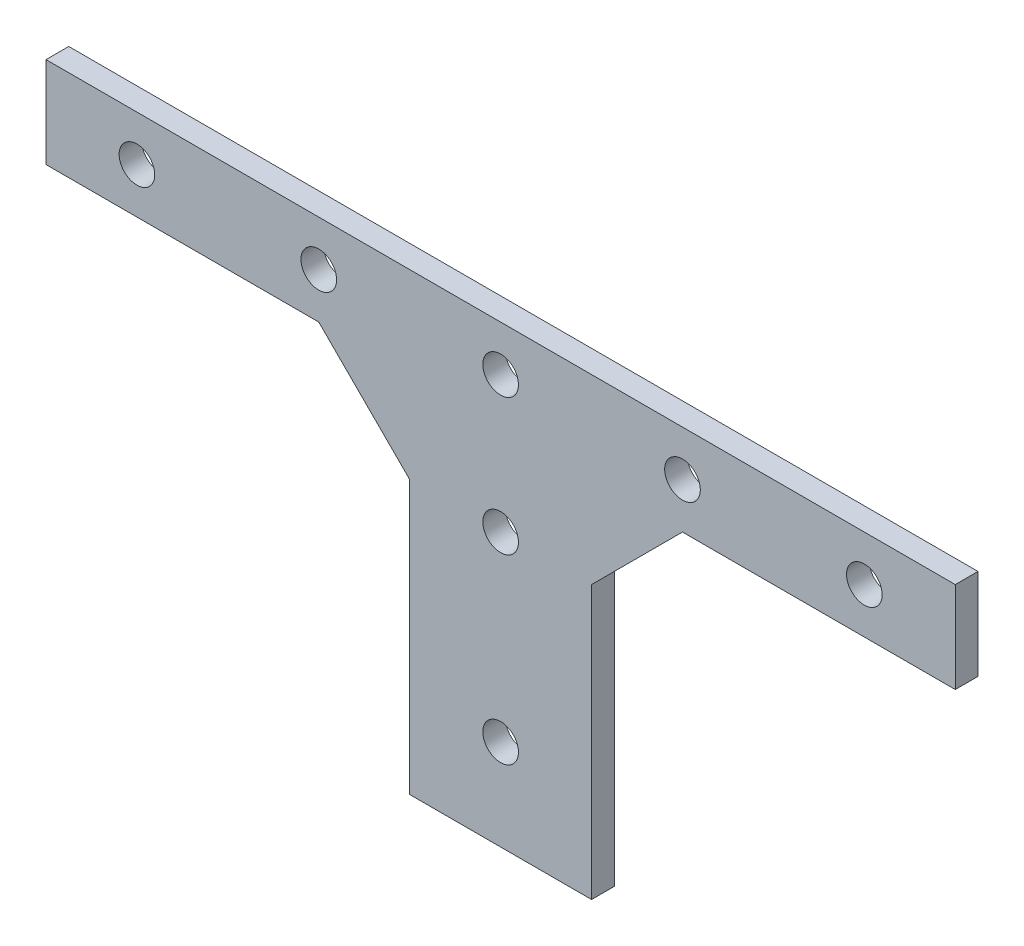
ISO-10303-21;
HEADER;
FILE_DESCRIPTION(('STEP AP214'),'2;1');
FILE_NAME('part.step','',(''),(''),'','','');
FILE_SCHEMA(('AUTOMOTIVE_DESIGN { 1 0 10303 214 1 1 1 1 }'));
ENDSEC;
DATA;
#1=APPLICATION_CONTEXT('core data for automotive mechanical design processes');
#2=APPLICATION_PROTOCOL_DEFINITION('international standard','automotive_design',2000,#1);
#3=PRODUCT_CONTEXT('',#1,'mechanical');
#4=PRODUCT('Part','Part','',(#3));
#5=PRODUCT_RELATED_PRODUCT_CATEGORY('part','',(#4));
#6=PRODUCT_DEFINITION_FORMATION('','',#4);
#7=PRODUCT_DEFINITION_CONTEXT('part definition',#1,'design');
#8=PRODUCT_DEFINITION('design','',#6,#7);
#9=PRODUCT_DEFINITION_SHAPE('','',#8);
#10=(LENGTH_UNIT() NAMED_UNIT(*) SI_UNIT(.MILLI.,.METRE.));
#11=(NAMED_UNIT(*) PLANE_ANGLE_UNIT() SI_UNIT($,.RADIAN.));
#12=(NAMED_UNIT(*) SI_UNIT($,.STERADIAN.) SOLID_ANGLE_UNIT());
#13=UNCERTAINTY_MEASURE_WITH_UNIT(LENGTH_MEASURE(1.E-05),#10,'distance_accuracy_value','');
#14=(GEOMETRIC_REPRESENTATION_CONTEXT(3) GLOBAL_UNCERTAINTY_ASSIGNED_CONTEXT((#13)) GLOBAL_UNIT_ASSIGNED_CONTEXT((#10,
#11,#12)) REPRESENTATION_CONTEXT('',''));
#15=CARTESIAN_POINT('',(0.,0.,0.));
#16=DIRECTION('',(0.,0.,1.));
#17=DIRECTION('',(1.,0.,0.));
#18=AXIS2_PLACEMENT_3D('',#15,#16,#17);
#19=CARTESIAN_POINT('',(41.2749999999985,-63.5,3.175));
#20=DIRECTION('',(0.,1.,0.));
#21=DIRECTION('',(0.,0.,1.));
#22=AXIS2_PLACEMENT_3D('',#19,#20,#21);
#23=PLANE('',#22);
#24=DIRECTION('',(1.,0.,0.));
#25=VECTOR('',#24,1.);
#26=CARTESIAN_POINT('',(41.2749999999985,-63.5,0.));
#27=LINE('',#26,#25);
#28=CARTESIAN_POINT('',(41.2749999999985,-63.5,0.));
#29=VERTEX_POINT('',#28);
#30=CARTESIAN_POINT('',(66.6749999999986,-63.5,0.));
#31=VERTEX_POINT('',#30);
#32=EDGE_CURVE('E156',#29,#31,#27,.T.);
#33=ORIENTED_EDGE('',*,*,#32,.T.);
#34=DIRECTION('',(0.,0.,-1.));
#35=VECTOR('',#34,1.);
#36=CARTESIAN_POINT('',(66.6749999999986,-63.5,3.175));
#37=LINE('',#36,#35);
#38=CARTESIAN_POINT('',(66.6749999999986,-63.5,3.175));
#39=VERTEX_POINT('',#38);
#40=EDGE_CURVE('E11',#39,#31,#37,.T.);
#41=ORIENTED_EDGE('',*,*,#40,.F.);
#42=DIRECTION('',(1.,0.,0.));
#43=VECTOR('',#42,1.);
#44=CARTESIAN_POINT('',(41.2749999999985,-63.5,3.175));
#45=LINE('',#44,#43);
#46=CARTESIAN_POINT('',(41.2749999999985,-63.5,3.175));
#47=VERTEX_POINT('',#46);
#48=EDGE_CURVE('E185',#47,#39,#45,.T.);
#49=ORIENTED_EDGE('',*,*,#48,.F.);
#50=DIRECTION('',(0.,0.,-1.));
#51=VECTOR('',#50,1.);
#52=CARTESIAN_POINT('',(41.2749999999985,-63.5,3.175));
#53=LINE('',#52,#51);
#54=EDGE_CURVE('E152',#47,#29,#53,.T.);
#55=ORIENTED_EDGE('',*,*,#54,.T.);
#56=EDGE_LOOP('',(#33,#41,#49,#55));
#57=FACE_BOUND('',#56,.T.);
#58=ADVANCED_FACE('F43',(#57),#23,.F.);
#59=CARTESIAN_POINT('',(66.6749999999986,-63.5,3.175));
#60=DIRECTION('',(-1.,0.,0.));
#61=DIRECTION('',(0.,0.,1.));
#62=AXIS2_PLACEMENT_3D('',#59,#60,#61);
#63=PLANE('',#62);
#64=DIRECTION('',(0.,1.,0.));
#65=VECTOR('',#64,1.);
#66=CARTESIAN_POINT('',(66.6749999999986,-63.5,0.));
#67=LINE('',#66,#65);
#68=CARTESIAN_POINT('',(66.6749999999986,-25.4,0.));
#69=VERTEX_POINT('',#68);
#70=EDGE_CURVE('E160',#31,#69,#67,.T.);
#71=ORIENTED_EDGE('',*,*,#70,.T.);
#72=DIRECTION('',(0.,0.,-1.));
#73=VECTOR('',#72,1.);
#74=CARTESIAN_POINT('',(66.6749999999986,-25.4,3.175));
#75=LINE('',#74,#73);
#76=CARTESIAN_POINT('',(66.6749999999986,-25.4,3.175));
#77=VERTEX_POINT('',#76);
#78=EDGE_CURVE('E52',#77,#69,#75,.T.);
#79=ORIENTED_EDGE('',*,*,#78,.F.);
#80=DIRECTION('',(0.,1.,0.));
#81=VECTOR('',#80,1.);
#82=CARTESIAN_POINT('',(66.6749999999986,-63.5,3.175));
#83=LINE('',#82,#81);
#84=EDGE_CURVE('E109',#39,#77,#83,.T.);
#85=ORIENTED_EDGE('',*,*,#84,.F.);
#86=ORIENTED_EDGE('',*,*,#40,.T.);
#87=EDGE_LOOP('',(#71,#79,#85,#86));
#88=FACE_BOUND('',#87,.T.);
#89=ADVANCED_FACE('F337',(#88),#63,.F.);
#90=CARTESIAN_POINT('',(66.6749999999986,-25.4,3.175));
#91=DIRECTION('',(-0.707106781186562,0.707106781186533,0.));
#92=DIRECTION('',(-0.707106781186533,-0.707106781186562,0.));
#93=AXIS2_PLACEMENT_3D('',#90,#91,#92);
#94=PLANE('',#93);
#95=DIRECTION('',(0.707106781186533,0.707106781186562,0.));
#96=VECTOR('',#95,1.);
#97=CARTESIAN_POINT('',(66.6749999999986,-25.4,0.));
#98=LINE('',#97,#96);
#99=CARTESIAN_POINT('',(79.3749999999981,-12.7,0.));
#100=VERTEX_POINT('',#99);
#101=EDGE_CURVE('E164',#69,#100,#98,.T.);
#102=ORIENTED_EDGE('',*,*,#101,.T.);
#103=DIRECTION('',(0.,0.,-1.));
#104=VECTOR('',#103,1.);
#105=CARTESIAN_POINT('',(79.3749999999981,-12.7,3.175));
#106=LINE('',#105,#104);
#107=CARTESIAN_POINT('',(79.3749999999981,-12.7,3.175));
#108=VERTEX_POINT('',#107);
#109=EDGE_CURVE('E204',#108,#100,#106,.T.);
#110=ORIENTED_EDGE('',*,*,#109,.F.);
#111=DIRECTION('',(0.707106781186533,0.707106781186562,0.));
#112=VECTOR('',#111,1.);
#113=CARTESIAN_POINT('',(66.6749999999986,-25.4,3.175));
#114=LINE('',#113,#112);
#115=EDGE_CURVE('E214',#77,#108,#114,.T.);
#116=ORIENTED_EDGE('',*,*,#115,.F.);
#117=ORIENTED_EDGE('',*,*,#78,.T.);
#118=EDGE_LOOP('',(#102,#110,#116,#117));
#119=FACE_BOUND('',#118,.T.);
#120=ADVANCED_FACE('F212',(#119),#94,.F.);
#121=CARTESIAN_POINT('',(79.3749999999981,-12.7,3.175));
#122=DIRECTION('',(0.,1.,0.));
#123=DIRECTION('',(-1.,0.,0.));
#124=AXIS2_PLACEMENT_3D('',#121,#122,#123);
#125=PLANE('',#124);
#126=DIRECTION('',(1.,0.,0.));
#127=VECTOR('',#126,1.);
#128=CARTESIAN_POINT('',(79.3749999999981,-12.7,0.));
#129=LINE('',#128,#127);
#130=CARTESIAN_POINT('',(117.474999999999,-12.6999999999999,0.));
#131=VERTEX_POINT('',#130);
#132=EDGE_CURVE('E167',#100,#131,#129,.T.);
#133=ORIENTED_EDGE('',*,*,#132,.T.);
#134=DIRECTION('',(0.,0.,-1.));
#135=VECTOR('',#134,1.);
#136=CARTESIAN_POINT('',(117.474999999999,-12.6999999999999,3.175));
#137=LINE('',#136,#135);
#138=CARTESIAN_POINT('',(117.474999999999,-12.6999999999999,3.175));
#139=VERTEX_POINT('',#138);
#140=EDGE_CURVE('E200',#139,#131,#137,.T.);
#141=ORIENTED_EDGE('',*,*,#140,.F.);
#142=DIRECTION('',(1.,0.,0.));
#143=VECTOR('',#142,1.);
#144=CARTESIAN_POINT('',(79.3749999999981,-12.7,3.175));
#145=LINE('',#144,#143);
#146=EDGE_CURVE('E233',#108,#139,#145,.T.);
#147=ORIENTED_EDGE('',*,*,#146,.F.);
#148=ORIENTED_EDGE('',*,*,#109,.T.);
#149=EDGE_LOOP('',(#133,#141,#147,#148));
#150=FACE_BOUND('',#149,.T.);
#151=ADVANCED_FACE('F223',(#150),#125,.F.);
#152=CARTESIAN_POINT('',(117.474999999999,-12.6999999999999,3.175));
#153=DIRECTION('',(-1.,0.,0.));
#154=DIRECTION('',(0.,0.,1.));
#155=AXIS2_PLACEMENT_3D('',#152,#153,#154);
#156=PLANE('',#155);
#157=DIRECTION('',(0.,1.,0.));
#158=VECTOR('',#157,1.);
#159=CARTESIAN_POINT('',(117.474999999999,-12.6999999999999,0.));
#160=LINE('',#159,#158);
#161=CARTESIAN_POINT('',(117.474999999999,-3.33066907387547E-13,0.));
#162=VERTEX_POINT('',#161);
#163=EDGE_CURVE('E170',#131,#162,#160,.T.);
#164=ORIENTED_EDGE('',*,*,#163,.T.);
#165=DIRECTION('',(0.,0.,-1.));
#166=VECTOR('',#165,1.);
#167=CARTESIAN_POINT('',(117.474999999999,-3.33066907387547E-13,3.175));
#168=LINE('',#167,#166);
#169=CARTESIAN_POINT('',(117.474999999999,-3.33066907387547E-13,3.175));
#170=VERTEX_POINT('',#169);
#171=EDGE_CURVE('E196',#170,#162,#168,.T.);
#172=ORIENTED_EDGE('',*,*,#171,.F.);
#173=DIRECTION('',(0.,1.,0.));
#174=VECTOR('',#173,1.);
#175=CARTESIAN_POINT('',(117.474999999999,-12.6999999999999,3.175));
#176=LINE('',#175,#174);
#177=EDGE_CURVE('E229',#139,#170,#176,.T.);
#178=ORIENTED_EDGE('',*,*,#177,.F.);
#179=ORIENTED_EDGE('',*,*,#140,.T.);
#180=EDGE_LOOP('',(#164,#172,#178,#179));
#181=FACE_BOUND('',#180,.T.);
#182=ADVANCED_FACE('F227',(#181),#156,.F.);
#183=CARTESIAN_POINT('',(117.474999999999,-3.33066907387547E-13,3.175));
#184=DIRECTION('',(0.,-1.,0.));
#185=DIRECTION('',(0.,0.,-1.));
#186=AXIS2_PLACEMENT_3D('',#183,#184,#185);
#187=PLANE('',#186);
#188=DIRECTION('',(-1.,0.,0.));
#189=VECTOR('',#188,1.);
#190=CARTESIAN_POINT('',(117.474999999999,-3.33066907387547E-13,0.));
#191=LINE('',#190,#189);
#192=CARTESIAN_POINT('',(-9.52500000000145,-3.33066907387547E-13,0.));
#193=VERTEX_POINT('',#192);
#194=EDGE_CURVE('E173',#162,#193,#191,.T.);
#195=ORIENTED_EDGE('',*,*,#194,.T.);
#196=DIRECTION('',(0.,0.,-1.));
#197=VECTOR('',#196,1.);
#198=CARTESIAN_POINT('',(-9.52500000000145,-3.33066907387547E-13,3.175));
#199=LINE('',#198,#197);
#200=CARTESIAN_POINT('',(-9.52500000000145,-3.33066907387547E-13,3.175));
#201=VERTEX_POINT('',#200);
#202=EDGE_CURVE('E192',#201,#193,#199,.T.);
#203=ORIENTED_EDGE('',*,*,#202,.F.);
#204=DIRECTION('',(-1.,0.,0.));
#205=VECTOR('',#204,1.);
#206=CARTESIAN_POINT('',(117.474999999999,-3.33066907387547E-13,3.175));
#207=LINE('',#206,#205);
#208=EDGE_CURVE('E232',#170,#201,#207,.T.);
#209=ORIENTED_EDGE('',*,*,#208,.F.);
#210=ORIENTED_EDGE('',*,*,#171,.T.);
#211=EDGE_LOOP('',(#195,#203,#209,#210));
#212=FACE_BOUND('',#211,.T.);
#213=ADVANCED_FACE('F349',(#212),#187,.F.);
#214=CARTESIAN_POINT('',(-9.52500000000145,-3.33066907387547E-13,3.175));
#215=DIRECTION('',(1.,0.,0.));
#216=DIRECTION('',(0.,0.,-1.));
#217=AXIS2_PLACEMENT_3D('',#214,#215,#216);
#218=PLANE('',#217);
#219=DIRECTION('',(0.,-1.,0.));
#220=VECTOR('',#219,1.);
#221=CARTESIAN_POINT('',(-9.52500000000145,-3.33066907387547E-13,0.));
#222=LINE('',#221,#220);
#223=CARTESIAN_POINT('',(-9.52500000000145,-12.6999999999999,0.));
#224=VERTEX_POINT('',#223);
#225=EDGE_CURVE('E176',#193,#224,#222,.T.);
#226=ORIENTED_EDGE('',*,*,#225,.T.);
#227=DIRECTION('',(0.,0.,-1.));
#228=VECTOR('',#227,1.);
#229=CARTESIAN_POINT('',(-9.52500000000145,-12.6999999999999,3.175));
#230=LINE('',#229,#228);
#231=CARTESIAN_POINT('',(-9.52500000000145,-12.6999999999999,3.175));
#232=VERTEX_POINT('',#231);
#233=EDGE_CURVE('E145',#232,#224,#230,.T.);
#234=ORIENTED_EDGE('',*,*,#233,.F.);
#235=DIRECTION('',(0.,-1.,0.));
#236=VECTOR('',#235,1.);
#237=CARTESIAN_POINT('',(-9.52500000000145,-3.33066907387547E-13,3.175));
#238=LINE('',#237,#236);
#239=EDGE_CURVE('E134',#201,#232,#238,.T.);
#240=ORIENTED_EDGE('',*,*,#239,.F.);
#241=ORIENTED_EDGE('',*,*,#202,.T.);
#242=EDGE_LOOP('',(#226,#234,#240,#241));
#243=FACE_BOUND('',#242,.T.);
#244=ADVANCED_FACE('F346',(#243),#218,.F.);
#245=CARTESIAN_POINT('',(-9.52500000000145,-12.6999999999999,3.175));
#246=DIRECTION('',(0.,1.,0.));
#247=DIRECTION('',(-1.,0.,0.));
#248=AXIS2_PLACEMENT_3D('',#245,#246,#247);
#249=PLANE('',#248);
#250=DIRECTION('',(1.,0.,0.));
#251=VECTOR('',#250,1.);
#252=CARTESIAN_POINT('',(-9.52500000000145,-12.6999999999999,0.));
#253=LINE('',#252,#251);
#254=CARTESIAN_POINT('',(28.5749999999979,-12.7,0.));
#255=VERTEX_POINT('',#254);
#256=EDGE_CURVE('E143',#224,#255,#253,.T.);
#257=ORIENTED_EDGE('',*,*,#256,.T.);
#258=DIRECTION('',(0.,0.,-1.));
#259=VECTOR('',#258,1.);
#260=CARTESIAN_POINT('',(28.5749999999979,-12.7,3.175));
#261=LINE('',#260,#259);
#262=CARTESIAN_POINT('',(28.5749999999979,-12.7,3.175));
#263=VERTEX_POINT('',#262);
#264=EDGE_CURVE('E140',#263,#255,#261,.T.);
#265=ORIENTED_EDGE('',*,*,#264,.F.);
#266=DIRECTION('',(1.,0.,0.));
#267=VECTOR('',#266,1.);
#268=CARTESIAN_POINT('',(-9.52500000000145,-12.6999999999999,3.175));
#269=LINE('',#268,#267);
#270=EDGE_CURVE('E128',#232,#263,#269,.T.);
#271=ORIENTED_EDGE('',*,*,#270,.F.);
#272=ORIENTED_EDGE('',*,*,#233,.T.);
#273=EDGE_LOOP('',(#257,#265,#271,#272));
#274=FACE_BOUND('',#273,.T.);
#275=ADVANCED_FACE('F141',(#274),#249,.F.);
#276=CARTESIAN_POINT('',(41.2749999999986,-25.4,3.175));
#277=DIRECTION('',(0.70710678118653,0.707106781186564,0.));
#278=DIRECTION('',(-0.707106781186565,0.70710678118653,0.));
#279=AXIS2_PLACEMENT_3D('',#276,#277,#278);
#280=PLANE('',#279);
#281=DIRECTION('',(0.707106781186565,-0.70710678118653,0.));
#282=VECTOR('',#281,1.);
#283=CARTESIAN_POINT('',(41.2749999999986,-25.4,0.));
#284=LINE('',#283,#282);
#285=CARTESIAN_POINT('',(41.2749999999986,-25.4,0.));
#286=VERTEX_POINT('',#285);
#287=EDGE_CURVE('E95',#255,#286,#284,.T.);
#288=ORIENTED_EDGE('',*,*,#287,.T.);
#289=DIRECTION('',(0.,0.,-1.));
#290=VECTOR('',#289,1.);
#291=CARTESIAN_POINT('',(41.2749999999986,-25.4,3.175));
#292=LINE('',#291,#290);
#293=CARTESIAN_POINT('',(41.2749999999986,-25.4,3.175));
#294=VERTEX_POINT('',#293);
#295=EDGE_CURVE('E146',#294,#286,#292,.T.);
#296=ORIENTED_EDGE('',*,*,#295,.F.);
#297=DIRECTION('',(0.707106781186565,-0.70710678118653,0.));
#298=VECTOR('',#297,1.);
#299=CARTESIAN_POINT('',(41.2749999999986,-25.4,3.175));
#300=LINE('',#299,#298);
#301=EDGE_CURVE('E132',#263,#294,#300,.T.);
#302=ORIENTED_EDGE('',*,*,#301,.F.);
#303=ORIENTED_EDGE('',*,*,#264,.T.);
#304=EDGE_LOOP('',(#288,#296,#302,#303));
#305=FACE_BOUND('',#304,.T.);
#306=ADVANCED_FACE('F148',(#305),#280,.F.);
#307=CARTESIAN_POINT('',(41.2749999999986,-25.4,3.175));
#308=DIRECTION('',(1.,0.,0.));
#309=DIRECTION('',(0.,1.,0.));
#310=AXIS2_PLACEMENT_3D('',#307,#308,#309);
#311=PLANE('',#310);
#312=DIRECTION('',(0.,-1.,0.));
#313=VECTOR('',#312,1.);
#314=CARTESIAN_POINT('',(41.2749999999986,-25.4,0.));
#315=LINE('',#314,#313);
#316=EDGE_CURVE('E101',#286,#29,#315,.T.);
#317=ORIENTED_EDGE('',*,*,#316,.T.);
#318=ORIENTED_EDGE('',*,*,#54,.F.);
#319=DIRECTION('',(0.,-1.,0.));
#320=VECTOR('',#319,1.);
#321=CARTESIAN_POINT('',(41.2749999999986,-25.4,3.175));
#322=LINE('',#321,#320);
#323=EDGE_CURVE('E60',#294,#47,#322,.T.);
#324=ORIENTED_EDGE('',*,*,#323,.F.);
#325=ORIENTED_EDGE('',*,*,#295,.T.);
#326=EDGE_LOOP('',(#317,#318,#324,#325));
#327=FACE_BOUND('',#326,.T.);
#328=ADVANCED_FACE('F307',(#327),#311,.F.);
#329=CARTESIAN_POINT('',(0.,0.,3.175));
#330=DIRECTION('',(0.,0.,1.));
#331=DIRECTION('',(1.,0.,0.));
#332=AXIS2_PLACEMENT_3D('',#329,#330,#331);
#333=PLANE('',#332);
#334=CARTESIAN_POINT('',(3.17499999999792,-6.35000000000014,3.175));
#335=DIRECTION('',(0.,0.,1.));
#336=DIRECTION('',(1.,0.,0.));
#337=AXIS2_PLACEMENT_3D('',#334,#335,#336);
#338=CIRCLE('',#337,2.48919999999999);
#339=CARTESIAN_POINT('',(5.66419999999791,-6.35000000000014,3.175));
#340=VERTEX_POINT('',#339);
#341=EDGE_CURVE('E298',#340,#340,#338,.T.);
#342=ORIENTED_EDGE('',*,*,#341,.F.);
#343=EDGE_LOOP('',(#342));
#344=FACE_BOUND('',#343,.T.);
#345=CARTESIAN_POINT('',(28.5749999999979,-6.35000000000014,3.175));
#346=DIRECTION('',(0.,0.,1.));
#347=DIRECTION('',(1.,0.,0.));
#348=AXIS2_PLACEMENT_3D('',#345,#346,#347);
#349=CIRCLE('',#348,2.48919999999999);
#350=CARTESIAN_POINT('',(31.0641999999979,-6.35000000000014,3.175));
#351=VERTEX_POINT('',#350);
#352=EDGE_CURVE('E290',#351,#351,#349,.T.);
#353=ORIENTED_EDGE('',*,*,#352,.F.);
#354=EDGE_LOOP('',(#353));
#355=FACE_BOUND('',#354,.T.);
#356=CARTESIAN_POINT('',(53.9749999999986,-6.35000000000014,3.175));
#357=DIRECTION('',(0.,0.,1.));
#358=DIRECTION('',(1.,0.,0.));
#359=AXIS2_PLACEMENT_3D('',#356,#357,#358);
#360=CIRCLE('',#359,2.48919999999999);
#361=CARTESIAN_POINT('',(56.4641999999985,-6.35000000000014,3.175));
#362=VERTEX_POINT('',#361);
#363=EDGE_CURVE('E282',#362,#362,#360,.T.);
#364=ORIENTED_EDGE('',*,*,#363,.F.);
#365=EDGE_LOOP('',(#364));
#366=FACE_BOUND('',#365,.T.);
#367=CARTESIAN_POINT('',(104.774999999999,-6.35000000000014,3.175));
#368=DIRECTION('',(0.,0.,1.));
#369=DIRECTION('',(1.,0.,0.));
#370=AXIS2_PLACEMENT_3D('',#367,#368,#369);
#371=CIRCLE('',#370,2.48919999999998);
#372=CARTESIAN_POINT('',(107.264199999999,-6.35000000000014,3.175));
#373=VERTEX_POINT('',#372);
#374=EDGE_CURVE('E274',#373,#373,#371,.T.);
#375=ORIENTED_EDGE('',*,*,#374,.F.);
#376=EDGE_LOOP('',(#375));
#377=FACE_BOUND('',#376,.T.);
#378=CARTESIAN_POINT('',(53.9749999999986,-25.3999999999999,3.175));
#379=DIRECTION('',(0.,0.,1.));
#380=DIRECTION('',(1.,0.,0.));
#381=AXIS2_PLACEMENT_3D('',#378,#379,#380);
#382=CIRCLE('',#381,2.48919999999999);
#383=CARTESIAN_POINT('',(56.4641999999985,-25.3999999999999,3.175));
#384=VERTEX_POINT('',#383);
#385=EDGE_CURVE('E266',#384,#384,#382,.T.);
#386=ORIENTED_EDGE('',*,*,#385,.F.);
#387=EDGE_LOOP('',(#386));
#388=FACE_BOUND('',#387,.T.);
#389=CARTESIAN_POINT('',(53.9749999999986,-50.7999999999999,3.175));
#390=DIRECTION('',(0.,0.,1.));
#391=DIRECTION('',(1.,0.,0.));
#392=AXIS2_PLACEMENT_3D('',#389,#390,#391);
#393=CIRCLE('',#392,2.48919999999999);
#394=CARTESIAN_POINT('',(56.4641999999985,-50.7999999999999,3.175));
#395=VERTEX_POINT('',#394);
#396=EDGE_CURVE('E258',#395,#395,#393,.T.);
#397=ORIENTED_EDGE('',*,*,#396,.F.);
#398=EDGE_LOOP('',(#397));
#399=FACE_BOUND('',#398,.T.);
#400=CARTESIAN_POINT('',(79.3749999999981,-6.35000000000014,3.175));
#401=DIRECTION('',(0.,0.,1.));
#402=DIRECTION('',(1.,0.,0.));
#403=AXIS2_PLACEMENT_3D('',#400,#401,#402);
#404=CIRCLE('',#403,2.48919999999998);
#405=CARTESIAN_POINT('',(81.864199999998,-6.35000000000014,3.175));
#406=VERTEX_POINT('',#405);
#407=EDGE_CURVE('E250',#406,#406,#404,.T.);
#408=ORIENTED_EDGE('',*,*,#407,.F.);
#409=EDGE_LOOP('',(#408));
#410=FACE_BOUND('',#409,.T.);
#411=ORIENTED_EDGE('',*,*,#48,.T.);
#412=ORIENTED_EDGE('',*,*,#84,.T.);
#413=ORIENTED_EDGE('',*,*,#115,.T.);
#414=ORIENTED_EDGE('',*,*,#146,.T.);
#415=ORIENTED_EDGE('',*,*,#177,.T.);
#416=ORIENTED_EDGE('',*,*,#208,.T.);
#417=ORIENTED_EDGE('',*,*,#239,.T.);
#418=ORIENTED_EDGE('',*,*,#270,.T.);
#419=ORIENTED_EDGE('',*,*,#301,.T.);
#420=ORIENTED_EDGE('',*,*,#323,.T.);
#421=EDGE_LOOP('',(#411,#412,#413,#414,#415,#416,#417,#418,#419,#420));
#422=FACE_BOUND('',#421,.T.);
#423=ADVANCED_FACE('F130',(#344,#355,#366,#377,#388,#399,#410,#422),#333,.T.);
#424=CARTESIAN_POINT('',(0.,0.,0.));
#425=DIRECTION('',(0.,0.,1.));
#426=DIRECTION('',(1.,0.,0.));
#427=AXIS2_PLACEMENT_3D('',#424,#425,#426);
#428=PLANE('',#427);
#429=CARTESIAN_POINT('',(3.17499999999792,-6.35000000000014,0.));
#430=DIRECTION('',(0.,0.,1.));
#431=DIRECTION('',(1.,0.,0.));
#432=AXIS2_PLACEMENT_3D('',#429,#430,#431);
#433=CIRCLE('',#432,2.48919999999999);
#434=CARTESIAN_POINT('',(5.66419999999791,-6.35000000000014,0.));
#435=VERTEX_POINT('',#434);
#436=EDGE_CURVE('E294',#435,#435,#433,.T.);
#437=ORIENTED_EDGE('',*,*,#436,.T.);
#438=EDGE_LOOP('',(#437));
#439=FACE_BOUND('',#438,.T.);
#440=CARTESIAN_POINT('',(28.5749999999979,-6.35000000000014,0.));
#441=DIRECTION('',(0.,0.,1.));
#442=DIRECTION('',(1.,0.,0.));
#443=AXIS2_PLACEMENT_3D('',#440,#441,#442);
#444=CIRCLE('',#443,2.48919999999999);
#445=CARTESIAN_POINT('',(31.0641999999979,-6.35000000000014,0.));
#446=VERTEX_POINT('',#445);
#447=EDGE_CURVE('E286',#446,#446,#444,.T.);
#448=ORIENTED_EDGE('',*,*,#447,.T.);
#449=EDGE_LOOP('',(#448));
#450=FACE_BOUND('',#449,.T.);
#451=CARTESIAN_POINT('',(53.9749999999986,-6.35000000000014,0.));
#452=DIRECTION('',(0.,0.,1.));
#453=DIRECTION('',(1.,0.,0.));
#454=AXIS2_PLACEMENT_3D('',#451,#452,#453);
#455=CIRCLE('',#454,2.48919999999999);
#456=CARTESIAN_POINT('',(56.4641999999985,-6.35000000000014,0.));
#457=VERTEX_POINT('',#456);
#458=EDGE_CURVE('E278',#457,#457,#455,.T.);
#459=ORIENTED_EDGE('',*,*,#458,.T.);
#460=EDGE_LOOP('',(#459));
#461=FACE_BOUND('',#460,.T.);
#462=CARTESIAN_POINT('',(104.774999999999,-6.35000000000014,0.));
#463=DIRECTION('',(0.,0.,1.));
#464=DIRECTION('',(1.,0.,0.));
#465=AXIS2_PLACEMENT_3D('',#462,#463,#464);
#466=CIRCLE('',#465,2.48919999999998);
#467=CARTESIAN_POINT('',(107.264199999999,-6.35000000000014,0.));
#468=VERTEX_POINT('',#467);
#469=EDGE_CURVE('E270',#468,#468,#466,.T.);
#470=ORIENTED_EDGE('',*,*,#469,.T.);
#471=EDGE_LOOP('',(#470));
#472=FACE_BOUND('',#471,.T.);
#473=CARTESIAN_POINT('',(53.9749999999986,-25.3999999999999,0.));
#474=DIRECTION('',(0.,0.,1.));
#475=DIRECTION('',(1.,0.,0.));
#476=AXIS2_PLACEMENT_3D('',#473,#474,#475);
#477=CIRCLE('',#476,2.48919999999999);
#478=CARTESIAN_POINT('',(56.4641999999985,-25.3999999999999,0.));
#479=VERTEX_POINT('',#478);
#480=EDGE_CURVE('E262',#479,#479,#477,.T.);
#481=ORIENTED_EDGE('',*,*,#480,.T.);
#482=EDGE_LOOP('',(#481));
#483=FACE_BOUND('',#482,.T.);
#484=CARTESIAN_POINT('',(53.9749999999986,-50.7999999999999,0.));
#485=DIRECTION('',(0.,0.,1.));
#486=DIRECTION('',(1.,0.,0.));
#487=AXIS2_PLACEMENT_3D('',#484,#485,#486);
#488=CIRCLE('',#487,2.48919999999999);
#489=CARTESIAN_POINT('',(56.4641999999985,-50.7999999999999,0.));
#490=VERTEX_POINT('',#489);
#491=EDGE_CURVE('E254',#490,#490,#488,.T.);
#492=ORIENTED_EDGE('',*,*,#491,.T.);
#493=EDGE_LOOP('',(#492));
#494=FACE_BOUND('',#493,.T.);
#495=CARTESIAN_POINT('',(79.3749999999981,-6.35000000000014,0.));
#496=DIRECTION('',(0.,0.,1.));
#497=DIRECTION('',(1.,0.,0.));
#498=AXIS2_PLACEMENT_3D('',#495,#496,#497);
#499=CIRCLE('',#498,2.48919999999998);
#500=CARTESIAN_POINT('',(81.864199999998,-6.35000000000014,0.));
#501=VERTEX_POINT('',#500);
#502=EDGE_CURVE('E161',#501,#501,#499,.T.);
#503=ORIENTED_EDGE('',*,*,#502,.T.);
#504=EDGE_LOOP('',(#503));
#505=FACE_BOUND('',#504,.T.);
#506=ORIENTED_EDGE('',*,*,#32,.F.);
#507=ORIENTED_EDGE('',*,*,#316,.F.);
#508=ORIENTED_EDGE('',*,*,#287,.F.);
#509=ORIENTED_EDGE('',*,*,#256,.F.);
#510=ORIENTED_EDGE('',*,*,#225,.F.);
#511=ORIENTED_EDGE('',*,*,#194,.F.);
#512=ORIENTED_EDGE('',*,*,#163,.F.);
#513=ORIENTED_EDGE('',*,*,#132,.F.);
#514=ORIENTED_EDGE('',*,*,#101,.F.);
#515=ORIENTED_EDGE('',*,*,#70,.F.);
#516=EDGE_LOOP('',(#506,#507,#508,#509,#510,#511,#512,#513,#514,#515));
#517=FACE_BOUND('',#516,.T.);
#518=ADVANCED_FACE('F218',(#439,#450,#461,#472,#483,#494,#505,#517),#428,.F.);
#519=CARTESIAN_POINT('',(79.3749999999981,-6.35000000000014,3.175));
#520=DIRECTION('',(0.,0.,1.));
#521=DIRECTION('',(1.,0.,0.));
#522=AXIS2_PLACEMENT_3D('',#519,#520,#521);
#523=CYLINDRICAL_SURFACE('',#522,2.48919999999998);
#524=ORIENTED_EDGE('',*,*,#502,.F.);
#525=EDGE_LOOP('',(#524));
#526=FACE_BOUND('',#525,.T.);
#527=ORIENTED_EDGE('',*,*,#407,.T.);
#528=EDGE_LOOP('',(#527));
#529=FACE_BOUND('',#528,.T.);
#530=ADVANCED_FACE('F321',(#526,#529),#523,.F.);
#531=CARTESIAN_POINT('',(53.9749999999986,-50.7999999999999,3.175));
#532=DIRECTION('',(0.,0.,1.));
#533=DIRECTION('',(1.,0.,0.));
#534=AXIS2_PLACEMENT_3D('',#531,#532,#533);
#535=CYLINDRICAL_SURFACE('',#534,2.48919999999999);
#536=ORIENTED_EDGE('',*,*,#491,.F.);
#537=EDGE_LOOP('',(#536));
#538=FACE_BOUND('',#537,.T.);
#539=ORIENTED_EDGE('',*,*,#396,.T.);
#540=EDGE_LOOP('',(#539));
#541=FACE_BOUND('',#540,.T.);
#542=ADVANCED_FACE('F323',(#538,#541),#535,.F.);
#543=CARTESIAN_POINT('',(53.9749999999986,-25.3999999999999,3.175));
#544=DIRECTION('',(0.,0.,1.));
#545=DIRECTION('',(1.,0.,0.));
#546=AXIS2_PLACEMENT_3D('',#543,#544,#545);
#547=CYLINDRICAL_SURFACE('',#546,2.48919999999999);
#548=ORIENTED_EDGE('',*,*,#480,.F.);
#549=EDGE_LOOP('',(#548));
#550=FACE_BOUND('',#549,.T.);
#551=ORIENTED_EDGE('',*,*,#385,.T.);
#552=EDGE_LOOP('',(#551));
#553=FACE_BOUND('',#552,.T.);
#554=ADVANCED_FACE('F330',(#550,#553),#547,.F.);
#555=CARTESIAN_POINT('',(104.774999999999,-6.35000000000014,3.175));
#556=DIRECTION('',(0.,0.,1.));
#557=DIRECTION('',(1.,0.,0.));
#558=AXIS2_PLACEMENT_3D('',#555,#556,#557);
#559=CYLINDRICAL_SURFACE('',#558,2.48919999999998);
#560=ORIENTED_EDGE('',*,*,#469,.F.);
#561=EDGE_LOOP('',(#560));
#562=FACE_BOUND('',#561,.T.);
#563=ORIENTED_EDGE('',*,*,#374,.T.);
#564=EDGE_LOOP('',(#563));
#565=FACE_BOUND('',#564,.T.);
#566=ADVANCED_FACE('F449',(#562,#565),#559,.F.);
#567=CARTESIAN_POINT('',(53.9749999999986,-6.35000000000014,3.175));
#568=DIRECTION('',(0.,0.,1.));
#569=DIRECTION('',(1.,0.,0.));
#570=AXIS2_PLACEMENT_3D('',#567,#568,#569);
#571=CYLINDRICAL_SURFACE('',#570,2.48919999999999);
#572=ORIENTED_EDGE('',*,*,#458,.F.);
#573=EDGE_LOOP('',(#572));
#574=FACE_BOUND('',#573,.T.);
#575=ORIENTED_EDGE('',*,*,#363,.T.);
#576=EDGE_LOOP('',(#575));
#577=FACE_BOUND('',#576,.T.);
#578=ADVANCED_FACE('F460',(#574,#577),#571,.F.);
#579=CARTESIAN_POINT('',(28.5749999999979,-6.35000000000014,3.175));
#580=DIRECTION('',(0.,0.,1.));
#581=DIRECTION('',(1.,0.,0.));
#582=AXIS2_PLACEMENT_3D('',#579,#580,#581);
#583=CYLINDRICAL_SURFACE('',#582,2.48919999999999);
#584=ORIENTED_EDGE('',*,*,#447,.F.);
#585=EDGE_LOOP('',(#584));
#586=FACE_BOUND('',#585,.T.);
#587=ORIENTED_EDGE('',*,*,#352,.T.);
#588=EDGE_LOOP('',(#587));
#589=FACE_BOUND('',#588,.T.);
#590=ADVANCED_FACE('F471',(#586,#589),#583,.F.);
#591=CARTESIAN_POINT('',(3.17499999999792,-6.35000000000014,3.175));
#592=DIRECTION('',(0.,0.,1.));
#593=DIRECTION('',(1.,0.,0.));
#594=AXIS2_PLACEMENT_3D('',#591,#592,#593);
#595=CYLINDRICAL_SURFACE('',#594,2.48919999999999);
#596=ORIENTED_EDGE('',*,*,#436,.F.);
#597=EDGE_LOOP('',(#596));
#598=FACE_BOUND('',#597,.T.);
#599=ORIENTED_EDGE('',*,*,#341,.T.);
#600=EDGE_LOOP('',(#599));
#601=FACE_BOUND('',#600,.T.);
#602=ADVANCED_FACE('F303',(#598,#601),#595,.F.);
#603=CLOSED_SHELL('',(#58,#89,#120,#151,#182,#213,#244,#275,#306,#328,#423,#518,#530,#542,#554,
#566,#578,#590,#602));
#604=MANIFOLD_SOLID_BREP('B2',#603);
#605=ADVANCED_BREP_SHAPE_REPRESENTATION('',(#18,#604),#14);
#606=SHAPE_DEFINITION_REPRESENTATION(#9,#605);
ENDSEC;
END-ISO-10303-21;
